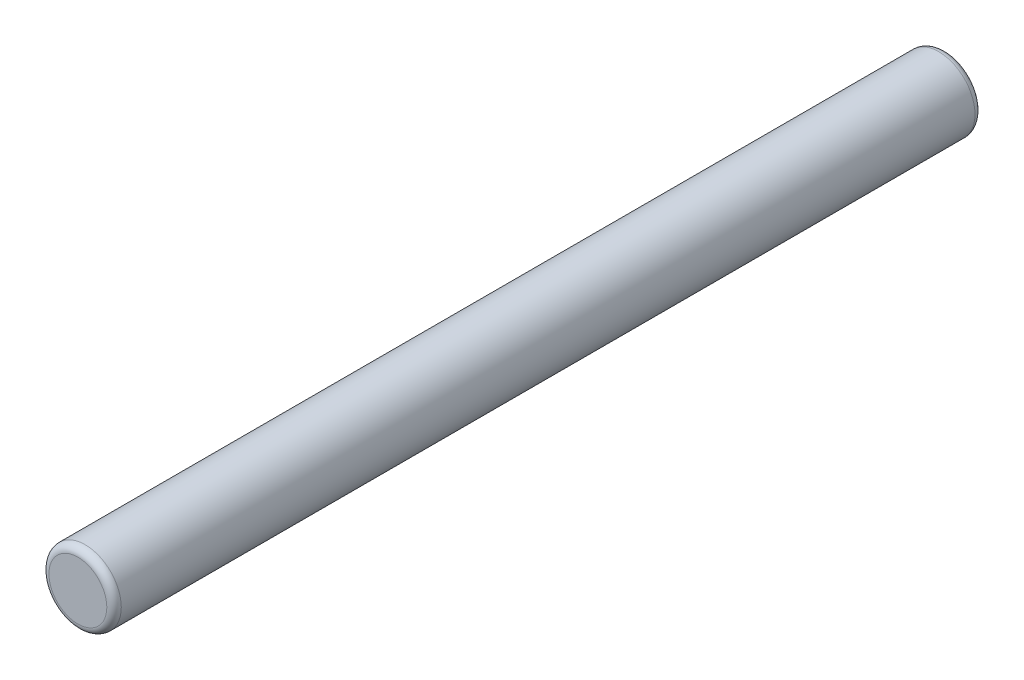
ISO-10303-21;
HEADER;
FILE_DESCRIPTION(('STEP AP214'),'2;1');
FILE_NAME('part.step','',(''),(''),'','','');
FILE_SCHEMA(('AUTOMOTIVE_DESIGN { 1 0 10303 214 1 1 1 1 }'));
ENDSEC;
DATA;
#1=APPLICATION_CONTEXT('core data for automotive mechanical design processes');
#2=APPLICATION_PROTOCOL_DEFINITION('international standard','automotive_design',2000,#1);
#3=PRODUCT_CONTEXT('',#1,'mechanical');
#4=PRODUCT('Part','Part','',(#3));
#5=PRODUCT_RELATED_PRODUCT_CATEGORY('part','',(#4));
#6=PRODUCT_DEFINITION_FORMATION('','',#4);
#7=PRODUCT_DEFINITION_CONTEXT('part definition',#1,'design');
#8=PRODUCT_DEFINITION('design','',#6,#7);
#9=PRODUCT_DEFINITION_SHAPE('','',#8);
#10=(LENGTH_UNIT() NAMED_UNIT(*) SI_UNIT(.MILLI.,.METRE.));
#11=(NAMED_UNIT(*) PLANE_ANGLE_UNIT() SI_UNIT($,.RADIAN.));
#12=(NAMED_UNIT(*) SI_UNIT($,.STERADIAN.) SOLID_ANGLE_UNIT());
#13=UNCERTAINTY_MEASURE_WITH_UNIT(LENGTH_MEASURE(1.E-05),#10,'distance_accuracy_value','');
#14=(GEOMETRIC_REPRESENTATION_CONTEXT(3) GLOBAL_UNCERTAINTY_ASSIGNED_CONTEXT((#13)) GLOBAL_UNIT_ASSIGNED_CONTEXT((#10,
#11,#12)) REPRESENTATION_CONTEXT('',''));
#15=CARTESIAN_POINT('',(0.,0.,0.));
#16=DIRECTION('',(0.,0.,1.));
#17=DIRECTION('',(1.,0.,0.));
#18=AXIS2_PLACEMENT_3D('',#15,#16,#17);
#19=CARTESIAN_POINT('',(0.,0.,60.));
#20=DIRECTION('',(0.,0.,-1.));
#21=DIRECTION('',(-1.,0.,0.));
#22=AXIS2_PLACEMENT_3D('',#19,#20,#21);
#23=CYLINDRICAL_SURFACE('',#22,2.5);
#24=CARTESIAN_POINT('',(0.,0.,0.5));
#25=DIRECTION('',(0.,0.,1.));
#26=DIRECTION('',(1.,0.,0.));
#27=AXIS2_PLACEMENT_3D('',#24,#25,#26);
#28=CIRCLE('',#27,2.5);
#29=CARTESIAN_POINT('',(2.5,0.,0.5));
#30=VERTEX_POINT('',#29);
#31=EDGE_CURVE('E41',#30,#30,#28,.T.);
#32=ORIENTED_EDGE('',*,*,#31,.T.);
#33=EDGE_LOOP('',(#32));
#34=FACE_BOUND('',#33,.T.);
#35=CARTESIAN_POINT('',(0.,0.,59.5));
#36=DIRECTION('',(0.,0.,1.));
#37=DIRECTION('',(1.,0.,0.));
#38=AXIS2_PLACEMENT_3D('',#35,#36,#37);
#39=CIRCLE('',#38,2.5);
#40=CARTESIAN_POINT('',(2.5,0.,59.5));
#41=VERTEX_POINT('',#40);
#42=EDGE_CURVE('E45',#41,#41,#39,.F.);
#43=ORIENTED_EDGE('',*,*,#42,.T.);
#44=EDGE_LOOP('',(#43));
#45=FACE_BOUND('',#44,.T.);
#46=ADVANCED_FACE('F30',(#34,#45),#23,.T.);
#47=CARTESIAN_POINT('',(0.,0.,60.));
#48=DIRECTION('',(0.,0.,1.));
#49=DIRECTION('',(1.,0.,0.));
#50=AXIS2_PLACEMENT_3D('',#47,#48,#49);
#51=PLANE('',#50);
#52=CARTESIAN_POINT('',(0.,0.,60.));
#53=DIRECTION('',(0.,0.,1.));
#54=DIRECTION('',(1.,0.,0.));
#55=AXIS2_PLACEMENT_3D('',#52,#53,#54);
#56=CIRCLE('',#55,2.);
#57=CARTESIAN_POINT('',(2.,0.,60.));
#58=VERTEX_POINT('',#57);
#59=EDGE_CURVE('E10',#58,#58,#56,.T.);
#60=ORIENTED_EDGE('',*,*,#59,.T.);
#61=EDGE_LOOP('',(#60));
#62=FACE_BOUND('',#61,.T.);
#63=ADVANCED_FACE('F61',(#62),#51,.T.);
#64=CARTESIAN_POINT('',(0.,0.,0.));
#65=DIRECTION('',(0.,0.,1.));
#66=DIRECTION('',(1.,0.,0.));
#67=AXIS2_PLACEMENT_3D('',#64,#65,#66);
#68=PLANE('',#67);
#69=CARTESIAN_POINT('',(0.,0.,0.));
#70=DIRECTION('',(0.,0.,1.));
#71=DIRECTION('',(1.,0.,0.));
#72=AXIS2_PLACEMENT_3D('',#69,#70,#71);
#73=CIRCLE('',#72,2.);
#74=CARTESIAN_POINT('',(2.,0.,0.));
#75=VERTEX_POINT('',#74);
#76=EDGE_CURVE('E37',#75,#75,#73,.F.);
#77=ORIENTED_EDGE('',*,*,#76,.T.);
#78=EDGE_LOOP('',(#77));
#79=FACE_BOUND('',#78,.T.);
#80=ADVANCED_FACE('F58',(#79),#68,.F.);
#81=CARTESIAN_POINT('',(0.,0.,0.5));
#82=DIRECTION('',(0.,0.,1.));
#83=DIRECTION('',(1.,0.,0.));
#84=AXIS2_PLACEMENT_3D('',#81,#82,#83);
#85=TOROIDAL_SURFACE('',#84,2.,0.5);
#86=ORIENTED_EDGE('',*,*,#76,.F.);
#87=EDGE_LOOP('',(#86));
#88=FACE_BOUND('',#87,.T.);
#89=ORIENTED_EDGE('',*,*,#31,.F.);
#90=EDGE_LOOP('',(#89));
#91=FACE_BOUND('',#90,.T.);
#92=ADVANCED_FACE('F54',(#88,#91),#85,.T.);
#93=CARTESIAN_POINT('',(0.,0.,59.5));
#94=DIRECTION('',(0.,0.,1.));
#95=DIRECTION('',(1.,0.,0.));
#96=AXIS2_PLACEMENT_3D('',#93,#94,#95);
#97=TOROIDAL_SURFACE('',#96,2.,0.5);
#98=ORIENTED_EDGE('',*,*,#42,.F.);
#99=EDGE_LOOP('',(#98));
#100=FACE_BOUND('',#99,.T.);
#101=ORIENTED_EDGE('',*,*,#59,.F.);
#102=EDGE_LOOP('',(#101));
#103=FACE_BOUND('',#102,.T.);
#104=ADVANCED_FACE('F32',(#100,#103),#97,.T.);
#105=CLOSED_SHELL('',(#46,#63,#80,#92,#104));
#106=MANIFOLD_SOLID_BREP('B2',#105);
#107=ADVANCED_BREP_SHAPE_REPRESENTATION('',(#18,#106),#14);
#108=SHAPE_DEFINITION_REPRESENTATION(#9,#107);
ENDSEC;
END-ISO-10303-21;
